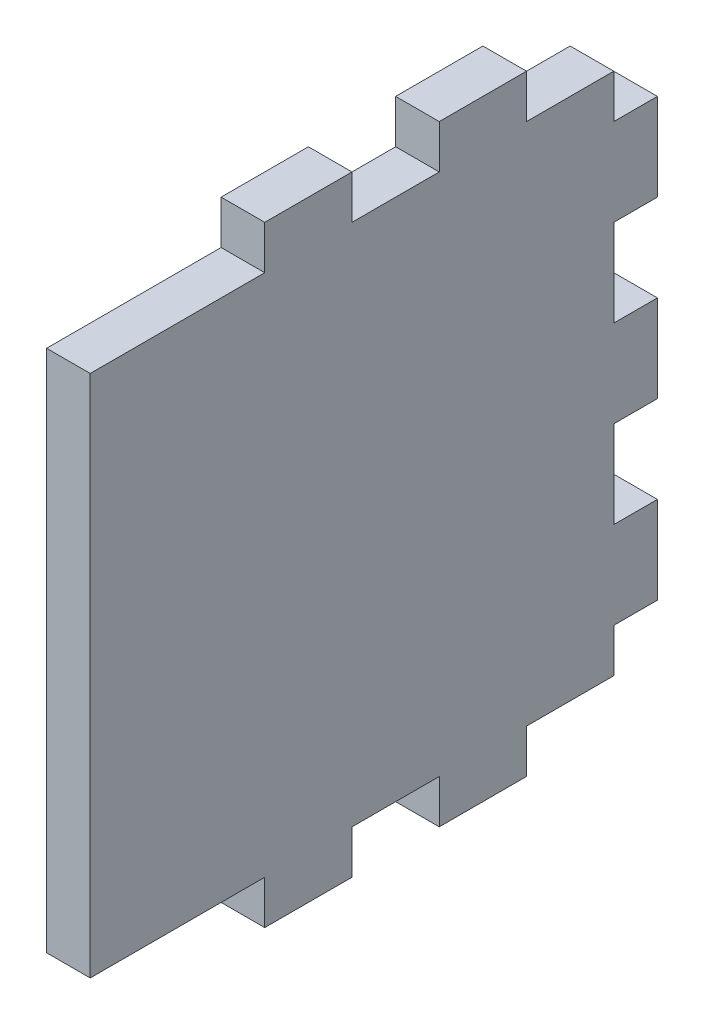
ISO-10303-21;
HEADER;
FILE_DESCRIPTION(('STEP AP214'),'2;1');
FILE_NAME('part.step','',(''),(''),'','','');
FILE_SCHEMA(('AUTOMOTIVE_DESIGN { 1 0 10303 214 1 1 1 1 }'));
ENDSEC;
DATA;
#1=APPLICATION_CONTEXT('core data for automotive mechanical design processes');
#2=APPLICATION_PROTOCOL_DEFINITION('international standard','automotive_design',2000,#1);
#3=PRODUCT_CONTEXT('',#1,'mechanical');
#4=PRODUCT('Part','Part','',(#3));
#5=PRODUCT_RELATED_PRODUCT_CATEGORY('part','',(#4));
#6=PRODUCT_DEFINITION_FORMATION('','',#4);
#7=PRODUCT_DEFINITION_CONTEXT('part definition',#1,'design');
#8=PRODUCT_DEFINITION('design','',#6,#7);
#9=PRODUCT_DEFINITION_SHAPE('','',#8);
#10=(LENGTH_UNIT() NAMED_UNIT(*) SI_UNIT(.MILLI.,.METRE.));
#11=(NAMED_UNIT(*) PLANE_ANGLE_UNIT() SI_UNIT($,.RADIAN.));
#12=(NAMED_UNIT(*) SI_UNIT($,.STERADIAN.) SOLID_ANGLE_UNIT());
#13=UNCERTAINTY_MEASURE_WITH_UNIT(LENGTH_MEASURE(1.E-05),#10,'distance_accuracy_value','');
#14=(GEOMETRIC_REPRESENTATION_CONTEXT(3) GLOBAL_UNCERTAINTY_ASSIGNED_CONTEXT((#13)) GLOBAL_UNIT_ASSIGNED_CONTEXT((#10,
#11,#12)) REPRESENTATION_CONTEXT('',''));
#15=CARTESIAN_POINT('',(0.,0.,0.));
#16=DIRECTION('',(0.,0.,1.));
#17=DIRECTION('',(1.,0.,0.));
#18=AXIS2_PLACEMENT_3D('',#15,#16,#17);
#19=CARTESIAN_POINT('',(6.35,0.,0.));
#20=DIRECTION('',(0.,1.,0.));
#21=DIRECTION('',(0.,0.,1.));
#22=AXIS2_PLACEMENT_3D('',#19,#20,#21);
#23=PLANE('',#22);
#24=DIRECTION('',(0.,0.,-1.));
#25=VECTOR('',#24,1.);
#26=CARTESIAN_POINT('',(0.,0.,0.));
#27=LINE('',#26,#25);
#28=CARTESIAN_POINT('',(0.,0.,57.15));
#29=VERTEX_POINT('',#28);
#30=CARTESIAN_POINT('',(0.,0.,44.45));
#31=VERTEX_POINT('',#30);
#32=EDGE_CURVE('E303',#29,#31,#27,.T.);
#33=ORIENTED_EDGE('',*,*,#32,.T.);
#34=DIRECTION('',(1.,0.,0.));
#35=VECTOR('',#34,1.);
#36=CARTESIAN_POINT('',(0.,0.,44.45));
#37=LINE('',#36,#35);
#38=CARTESIAN_POINT('',(6.35,0.,44.45));
#39=VERTEX_POINT('',#38);
#40=EDGE_CURVE('E516',#31,#39,#37,.T.);
#41=ORIENTED_EDGE('',*,*,#40,.T.);
#42=DIRECTION('',(0.,0.,-1.));
#43=VECTOR('',#42,1.);
#44=CARTESIAN_POINT('',(6.35,0.,0.));
#45=LINE('',#44,#43);
#46=CARTESIAN_POINT('',(6.35,0.,57.15));
#47=VERTEX_POINT('',#46);
#48=EDGE_CURVE('E432',#47,#39,#45,.T.);
#49=ORIENTED_EDGE('',*,*,#48,.F.);
#50=DIRECTION('',(1.,0.,0.));
#51=VECTOR('',#50,1.);
#52=CARTESIAN_POINT('',(0.,0.,57.15));
#53=LINE('',#52,#51);
#54=EDGE_CURVE('E357',#29,#47,#53,.T.);
#55=ORIENTED_EDGE('',*,*,#54,.F.);
#56=EDGE_LOOP('',(#33,#41,#49,#55));
#57=FACE_BOUND('',#56,.T.);
#58=ADVANCED_FACE('F45',(#57),#23,.F.);
#59=CARTESIAN_POINT('',(6.35,0.,0.));
#60=DIRECTION('',(0.,0.,1.));
#61=DIRECTION('',(1.,0.,0.));
#62=AXIS2_PLACEMENT_3D('',#59,#60,#61);
#63=PLANE('',#62);
#64=DIRECTION('',(0.,1.,0.));
#65=VECTOR('',#64,1.);
#66=CARTESIAN_POINT('',(0.,0.,0.));
#67=LINE('',#66,#65);
#68=CARTESIAN_POINT('',(0.,38.1,0.));
#69=VERTEX_POINT('',#68);
#70=CARTESIAN_POINT('',(0.,50.8,0.));
#71=VERTEX_POINT('',#70);
#72=EDGE_CURVE('E308',#69,#71,#67,.T.);
#73=ORIENTED_EDGE('',*,*,#72,.T.);
#74=DIRECTION('',(1.,0.,0.));
#75=VECTOR('',#74,1.);
#76=CARTESIAN_POINT('',(0.,50.8,0.));
#77=LINE('',#76,#75);
#78=CARTESIAN_POINT('',(6.35,50.8,0.));
#79=VERTEX_POINT('',#78);
#80=EDGE_CURVE('E329',#71,#79,#77,.T.);
#81=ORIENTED_EDGE('',*,*,#80,.T.);
#82=DIRECTION('',(0.,1.,0.));
#83=VECTOR('',#82,1.);
#84=CARTESIAN_POINT('',(6.35,0.,0.));
#85=LINE('',#84,#83);
#86=CARTESIAN_POINT('',(6.35,38.1,0.));
#87=VERTEX_POINT('',#86);
#88=EDGE_CURVE('E294',#87,#79,#85,.T.);
#89=ORIENTED_EDGE('',*,*,#88,.F.);
#90=DIRECTION('',(1.,0.,0.));
#91=VECTOR('',#90,1.);
#92=CARTESIAN_POINT('',(0.,38.1,0.));
#93=LINE('',#92,#91);
#94=EDGE_CURVE('E331',#69,#87,#93,.T.);
#95=ORIENTED_EDGE('',*,*,#94,.F.);
#96=EDGE_LOOP('',(#73,#81,#89,#95));
#97=FACE_BOUND('',#96,.T.);
#98=ADVANCED_FACE('F327',(#97),#63,.F.);
#99=CARTESIAN_POINT('',(6.35,12.7,0.));
#100=VERTEX_POINT('',#99);
#101=CARTESIAN_POINT('',(6.35,25.4,0.));
#102=VERTEX_POINT('',#101);
#103=EDGE_CURVE('E288',#100,#102,#85,.T.);
#104=ORIENTED_EDGE('',*,*,#103,.F.);
#105=DIRECTION('',(1.,0.,0.));
#106=VECTOR('',#105,1.);
#107=CARTESIAN_POINT('',(0.,12.7,0.));
#108=LINE('',#107,#106);
#109=CARTESIAN_POINT('',(0.,12.7,0.));
#110=VERTEX_POINT('',#109);
#111=EDGE_CURVE('E540',#110,#100,#108,.T.);
#112=ORIENTED_EDGE('',*,*,#111,.F.);
#113=CARTESIAN_POINT('',(0.,25.4,0.));
#114=VERTEX_POINT('',#113);
#115=EDGE_CURVE('E309',#110,#114,#67,.T.);
#116=ORIENTED_EDGE('',*,*,#115,.T.);
#117=DIRECTION('',(1.,0.,0.));
#118=VECTOR('',#117,1.);
#119=CARTESIAN_POINT('',(0.,25.4,0.));
#120=LINE('',#119,#118);
#121=EDGE_CURVE('E475',#114,#102,#120,.T.);
#122=ORIENTED_EDGE('',*,*,#121,.T.);
#123=EDGE_LOOP('',(#104,#112,#116,#122));
#124=FACE_BOUND('',#123,.T.);
#125=ADVANCED_FACE('F648',(#124),#63,.F.);
#126=CARTESIAN_POINT('',(6.35,88.9,0.));
#127=DIRECTION('',(0.,-1.,0.));
#128=DIRECTION('',(0.,0.,-1.));
#129=AXIS2_PLACEMENT_3D('',#126,#127,#128);
#130=PLANE('',#129);
#131=DIRECTION('',(0.,0.,1.));
#132=VECTOR('',#131,1.);
#133=CARTESIAN_POINT('',(6.35,88.9,0.));
#134=LINE('',#133,#132);
#135=CARTESIAN_POINT('',(6.35,88.9,44.45));
#136=VERTEX_POINT('',#135);
#137=CARTESIAN_POINT('',(6.35,88.9,57.15));
#138=VERTEX_POINT('',#137);
#139=EDGE_CURVE('E277',#136,#138,#134,.T.);
#140=ORIENTED_EDGE('',*,*,#139,.F.);
#141=DIRECTION('',(1.,0.,0.));
#142=VECTOR('',#141,1.);
#143=CARTESIAN_POINT('',(0.,88.9,44.45));
#144=LINE('',#143,#142);
#145=CARTESIAN_POINT('',(0.,88.9,44.45));
#146=VERTEX_POINT('',#145);
#147=EDGE_CURVE('E257',#146,#136,#144,.T.);
#148=ORIENTED_EDGE('',*,*,#147,.F.);
#149=DIRECTION('',(0.,0.,1.));
#150=VECTOR('',#149,1.);
#151=CARTESIAN_POINT('',(0.,88.9,0.));
#152=LINE('',#151,#150);
#153=CARTESIAN_POINT('',(0.,88.9,57.15));
#154=VERTEX_POINT('',#153);
#155=EDGE_CURVE('E310',#146,#154,#152,.T.);
#156=ORIENTED_EDGE('',*,*,#155,.T.);
#157=DIRECTION('',(1.,0.,0.));
#158=VECTOR('',#157,1.);
#159=CARTESIAN_POINT('',(0.,88.9,57.15));
#160=LINE('',#159,#158);
#161=EDGE_CURVE('E286',#154,#138,#160,.T.);
#162=ORIENTED_EDGE('',*,*,#161,.T.);
#163=EDGE_LOOP('',(#140,#148,#156,#162));
#164=FACE_BOUND('',#163,.T.);
#165=ADVANCED_FACE('F285',(#164),#130,.F.);
#166=CARTESIAN_POINT('',(0.,0.,31.75));
#167=VERTEX_POINT('',#166);
#168=CARTESIAN_POINT('',(0.,0.,19.05));
#169=VERTEX_POINT('',#168);
#170=EDGE_CURVE('E299',#167,#169,#27,.T.);
#171=ORIENTED_EDGE('',*,*,#170,.T.);
#172=DIRECTION('',(1.,0.,0.));
#173=VECTOR('',#172,1.);
#174=CARTESIAN_POINT('',(0.,0.,19.05));
#175=LINE('',#174,#173);
#176=CARTESIAN_POINT('',(6.35,0.,19.05));
#177=VERTEX_POINT('',#176);
#178=EDGE_CURVE('E282',#169,#177,#175,.T.);
#179=ORIENTED_EDGE('',*,*,#178,.T.);
#180=CARTESIAN_POINT('',(6.35,0.,31.75));
#181=VERTEX_POINT('',#180);
#182=EDGE_CURVE('E430',#181,#177,#45,.T.);
#183=ORIENTED_EDGE('',*,*,#182,.F.);
#184=DIRECTION('',(1.,0.,0.));
#185=VECTOR('',#184,1.);
#186=CARTESIAN_POINT('',(0.,0.,31.75));
#187=LINE('',#186,#185);
#188=EDGE_CURVE('E506',#167,#181,#187,.T.);
#189=ORIENTED_EDGE('',*,*,#188,.F.);
#190=EDGE_LOOP('',(#171,#179,#183,#189));
#191=FACE_BOUND('',#190,.T.);
#192=ADVANCED_FACE('F47',(#191),#23,.F.);
#193=CARTESIAN_POINT('',(6.35,63.5,0.));
#194=VERTEX_POINT('',#193);
#195=CARTESIAN_POINT('',(6.35,76.2,0.));
#196=VERTEX_POINT('',#195);
#197=EDGE_CURVE('E296',#194,#196,#85,.T.);
#198=ORIENTED_EDGE('',*,*,#197,.F.);
#199=DIRECTION('',(1.,0.,0.));
#200=VECTOR('',#199,1.);
#201=CARTESIAN_POINT('',(0.,63.5,0.));
#202=LINE('',#201,#200);
#203=CARTESIAN_POINT('',(0.,63.5,0.));
#204=VERTEX_POINT('',#203);
#205=EDGE_CURVE('E584',#204,#194,#202,.T.);
#206=ORIENTED_EDGE('',*,*,#205,.F.);
#207=CARTESIAN_POINT('',(0.,76.2,0.));
#208=VERTEX_POINT('',#207);
#209=EDGE_CURVE('E305',#204,#208,#67,.T.);
#210=ORIENTED_EDGE('',*,*,#209,.T.);
#211=DIRECTION('',(1.,0.,0.));
#212=VECTOR('',#211,1.);
#213=CARTESIAN_POINT('',(0.,76.2,0.));
#214=LINE('',#213,#212);
#215=EDGE_CURVE('E422',#208,#196,#214,.T.);
#216=ORIENTED_EDGE('',*,*,#215,.T.);
#217=EDGE_LOOP('',(#198,#206,#210,#216));
#218=FACE_BOUND('',#217,.T.);
#219=ADVANCED_FACE('F649',(#218),#63,.F.);
#220=CARTESIAN_POINT('',(0.,88.9,19.05));
#221=VERTEX_POINT('',#220);
#222=CARTESIAN_POINT('',(0.,88.9,31.75));
#223=VERTEX_POINT('',#222);
#224=EDGE_CURVE('E312',#221,#223,#152,.T.);
#225=ORIENTED_EDGE('',*,*,#224,.T.);
#226=DIRECTION('',(1.,0.,0.));
#227=VECTOR('',#226,1.);
#228=CARTESIAN_POINT('',(0.,88.9,31.75));
#229=LINE('',#228,#227);
#230=CARTESIAN_POINT('',(6.35,88.9,31.75));
#231=VERTEX_POINT('',#230);
#232=EDGE_CURVE('E269',#223,#231,#229,.T.);
#233=ORIENTED_EDGE('',*,*,#232,.T.);
#234=CARTESIAN_POINT('',(6.35,88.9,19.05));
#235=VERTEX_POINT('',#234);
#236=EDGE_CURVE('E55',#235,#231,#134,.T.);
#237=ORIENTED_EDGE('',*,*,#236,.F.);
#238=DIRECTION('',(1.,0.,0.));
#239=VECTOR('',#238,1.);
#240=CARTESIAN_POINT('',(0.,88.9,19.05));
#241=LINE('',#240,#239);
#242=EDGE_CURVE('E419',#221,#235,#241,.T.);
#243=ORIENTED_EDGE('',*,*,#242,.F.);
#244=EDGE_LOOP('',(#225,#233,#237,#243));
#245=FACE_BOUND('',#244,.T.);
#246=ADVANCED_FACE('F657',(#245),#130,.F.);
#247=CARTESIAN_POINT('',(6.35,0.,82.55));
#248=DIRECTION('',(0.,0.,-1.));
#249=DIRECTION('',(-1.,0.,0.));
#250=AXIS2_PLACEMENT_3D('',#247,#248,#249);
#251=PLANE('',#250);
#252=DIRECTION('',(0.,-1.,0.));
#253=VECTOR('',#252,1.);
#254=CARTESIAN_POINT('',(0.,0.,82.55));
#255=LINE('',#254,#253);
#256=CARTESIAN_POINT('',(0.,82.55,82.55));
#257=VERTEX_POINT('',#256);
#258=CARTESIAN_POINT('',(0.,6.35,82.55));
#259=VERTEX_POINT('',#258);
#260=EDGE_CURVE('E49',#257,#259,#255,.T.);
#261=ORIENTED_EDGE('',*,*,#260,.T.);
#262=DIRECTION('',(1.,0.,0.));
#263=VECTOR('',#262,1.);
#264=CARTESIAN_POINT('',(0.,6.35,82.55));
#265=LINE('',#264,#263);
#266=CARTESIAN_POINT('',(6.35,6.35,82.55));
#267=VERTEX_POINT('',#266);
#268=EDGE_CURVE('E364',#259,#267,#265,.T.);
#269=ORIENTED_EDGE('',*,*,#268,.T.);
#270=DIRECTION('',(0.,-1.,0.));
#271=VECTOR('',#270,1.);
#272=CARTESIAN_POINT('',(6.35,0.,82.55));
#273=LINE('',#272,#271);
#274=CARTESIAN_POINT('',(6.35,82.55,82.55));
#275=VERTEX_POINT('',#274);
#276=EDGE_CURVE('E11',#275,#267,#273,.T.);
#277=ORIENTED_EDGE('',*,*,#276,.F.);
#278=DIRECTION('',(1.,0.,0.));
#279=VECTOR('',#278,1.);
#280=CARTESIAN_POINT('',(0.,82.55,82.55));
#281=LINE('',#280,#279);
#282=EDGE_CURVE('E445',#257,#275,#281,.T.);
#283=ORIENTED_EDGE('',*,*,#282,.F.);
#284=EDGE_LOOP('',(#261,#269,#277,#283));
#285=FACE_BOUND('',#284,.T.);
#286=ADVANCED_FACE('F443',(#285),#251,.F.);
#287=CARTESIAN_POINT('',(6.35,0.,0.));
#288=DIRECTION('',(-1.,0.,0.));
#289=DIRECTION('',(0.,0.,1.));
#290=AXIS2_PLACEMENT_3D('',#287,#288,#289);
#291=PLANE('',#290);
#292=ORIENTED_EDGE('',*,*,#182,.T.);
#293=DIRECTION('',(0.,-1.,0.));
#294=VECTOR('',#293,1.);
#295=CARTESIAN_POINT('',(6.35,6.35,19.05));
#296=LINE('',#295,#294);
#297=CARTESIAN_POINT('',(6.35,6.35,19.05));
#298=VERTEX_POINT('',#297);
#299=EDGE_CURVE('E556',#298,#177,#296,.T.);
#300=ORIENTED_EDGE('',*,*,#299,.F.);
#301=DIRECTION('',(0.,0.,1.));
#302=VECTOR('',#301,1.);
#303=CARTESIAN_POINT('',(6.35,6.35,6.35));
#304=LINE('',#303,#302);
#305=CARTESIAN_POINT('',(6.35,6.35,6.35));
#306=VERTEX_POINT('',#305);
#307=EDGE_CURVE('E559',#306,#298,#304,.T.);
#308=ORIENTED_EDGE('',*,*,#307,.F.);
#309=DIRECTION('',(0.,-1.,0.));
#310=VECTOR('',#309,1.);
#311=CARTESIAN_POINT('',(6.35,6.35,6.35));
#312=LINE('',#311,#310);
#313=CARTESIAN_POINT('',(6.35,12.7,6.35));
#314=VERTEX_POINT('',#313);
#315=EDGE_CURVE('E564',#314,#306,#312,.T.);
#316=ORIENTED_EDGE('',*,*,#315,.F.);
#317=DIRECTION('',(0.,0.,1.));
#318=VECTOR('',#317,1.);
#319=CARTESIAN_POINT('',(6.35,12.7,0.));
#320=LINE('',#319,#318);
#321=EDGE_CURVE('E520',#100,#314,#320,.T.);
#322=ORIENTED_EDGE('',*,*,#321,.F.);
#323=ORIENTED_EDGE('',*,*,#103,.T.);
#324=DIRECTION('',(0.,0.,-1.));
#325=VECTOR('',#324,1.);
#326=CARTESIAN_POINT('',(6.35,25.4,0.));
#327=LINE('',#326,#325);
#328=CARTESIAN_POINT('',(6.35,25.4,6.35));
#329=VERTEX_POINT('',#328);
#330=EDGE_CURVE('E496',#329,#102,#327,.T.);
#331=ORIENTED_EDGE('',*,*,#330,.F.);
#332=DIRECTION('',(0.,-1.,0.));
#333=VECTOR('',#332,1.);
#334=CARTESIAN_POINT('',(6.35,25.4,6.35));
#335=LINE('',#334,#333);
#336=CARTESIAN_POINT('',(6.35,38.1,6.35));
#337=VERTEX_POINT('',#336);
#338=EDGE_CURVE('E487',#337,#329,#335,.T.);
#339=ORIENTED_EDGE('',*,*,#338,.F.);
#340=DIRECTION('',(0.,0.,1.));
#341=VECTOR('',#340,1.);
#342=CARTESIAN_POINT('',(6.35,38.1,0.));
#343=LINE('',#342,#341);
#344=EDGE_CURVE('E491',#87,#337,#343,.T.);
#345=ORIENTED_EDGE('',*,*,#344,.F.);
#346=ORIENTED_EDGE('',*,*,#88,.T.);
#347=DIRECTION('',(0.,0.,-1.));
#348=VECTOR('',#347,1.);
#349=CARTESIAN_POINT('',(6.35,50.8,0.));
#350=LINE('',#349,#348);
#351=CARTESIAN_POINT('',(6.35,50.8,6.35));
#352=VERTEX_POINT('',#351);
#353=EDGE_CURVE('E407',#352,#79,#350,.T.);
#354=ORIENTED_EDGE('',*,*,#353,.F.);
#355=DIRECTION('',(0.,-1.,0.));
#356=VECTOR('',#355,1.);
#357=CARTESIAN_POINT('',(6.35,50.8,6.35));
#358=LINE('',#357,#356);
#359=CARTESIAN_POINT('',(6.35,63.5,6.35));
#360=VERTEX_POINT('',#359);
#361=EDGE_CURVE('E346',#360,#352,#358,.T.);
#362=ORIENTED_EDGE('',*,*,#361,.F.);
#363=DIRECTION('',(0.,0.,1.));
#364=VECTOR('',#363,1.);
#365=CARTESIAN_POINT('',(6.35,63.5,0.));
#366=LINE('',#365,#364);
#367=EDGE_CURVE('E352',#194,#360,#366,.T.);
#368=ORIENTED_EDGE('',*,*,#367,.F.);
#369=ORIENTED_EDGE('',*,*,#197,.T.);
#370=DIRECTION('',(0.,0.,-1.));
#371=VECTOR('',#370,1.);
#372=CARTESIAN_POINT('',(6.35,76.2,0.));
#373=LINE('',#372,#371);
#374=CARTESIAN_POINT('',(6.35,76.2,6.35000000000001));
#375=VERTEX_POINT('',#374);
#376=EDGE_CURVE('E411',#375,#196,#373,.T.);
#377=ORIENTED_EDGE('',*,*,#376,.F.);
#378=DIRECTION('',(0.,-1.,0.));
#379=VECTOR('',#378,1.);
#380=CARTESIAN_POINT('',(6.35,76.2,6.35000000000001));
#381=LINE('',#380,#379);
#382=CARTESIAN_POINT('',(6.35,82.55,6.35000000000001));
#383=VERTEX_POINT('',#382);
#384=EDGE_CURVE('E406',#383,#375,#381,.T.);
#385=ORIENTED_EDGE('',*,*,#384,.F.);
#386=DIRECTION('',(0.,0.,-1.));
#387=VECTOR('',#386,1.);
#388=CARTESIAN_POINT('',(6.35,82.55,6.35000000000001));
#389=LINE('',#388,#387);
#390=CARTESIAN_POINT('',(6.35,82.55,19.05));
#391=VERTEX_POINT('',#390);
#392=EDGE_CURVE('E402',#391,#383,#389,.T.);
#393=ORIENTED_EDGE('',*,*,#392,.F.);
#394=DIRECTION('',(0.,-1.,0.));
#395=VECTOR('',#394,1.);
#396=CARTESIAN_POINT('',(6.35,88.9,19.05));
#397=LINE('',#396,#395);
#398=EDGE_CURVE('E389',#235,#391,#397,.T.);
#399=ORIENTED_EDGE('',*,*,#398,.F.);
#400=ORIENTED_EDGE('',*,*,#236,.T.);
#401=DIRECTION('',(0.,1.,0.));
#402=VECTOR('',#401,1.);
#403=CARTESIAN_POINT('',(6.35,88.9,31.75));
#404=LINE('',#403,#402);
#405=CARTESIAN_POINT('',(6.35,82.55,31.75));
#406=VERTEX_POINT('',#405);
#407=EDGE_CURVE('E599',#406,#231,#404,.T.);
#408=ORIENTED_EDGE('',*,*,#407,.F.);
#409=DIRECTION('',(0.,0.,-1.));
#410=VECTOR('',#409,1.);
#411=CARTESIAN_POINT('',(6.35,82.55,44.45));
#412=LINE('',#411,#410);
#413=CARTESIAN_POINT('',(6.35,82.55,44.45));
#414=VERTEX_POINT('',#413);
#415=EDGE_CURVE('E280',#414,#406,#412,.T.);
#416=ORIENTED_EDGE('',*,*,#415,.F.);
#417=DIRECTION('',(0.,-1.,0.));
#418=VECTOR('',#417,1.);
#419=CARTESIAN_POINT('',(6.35,88.9,44.45));
#420=LINE('',#419,#418);
#421=EDGE_CURVE('E260',#136,#414,#420,.T.);
#422=ORIENTED_EDGE('',*,*,#421,.F.);
#423=ORIENTED_EDGE('',*,*,#139,.T.);
#424=DIRECTION('',(0.,1.,0.));
#425=VECTOR('',#424,1.);
#426=CARTESIAN_POINT('',(6.35,88.9,57.15));
#427=LINE('',#426,#425);
#428=CARTESIAN_POINT('',(6.35,82.55,57.15));
#429=VERTEX_POINT('',#428);
#430=EDGE_CURVE('E461',#429,#138,#427,.T.);
#431=ORIENTED_EDGE('',*,*,#430,.F.);
#432=DIRECTION('',(0.,0.,-1.));
#433=VECTOR('',#432,1.);
#434=CARTESIAN_POINT('',(6.35,82.55,82.55));
#435=LINE('',#434,#433);
#436=EDGE_CURVE('E270',#275,#429,#435,.T.);
#437=ORIENTED_EDGE('',*,*,#436,.F.);
#438=ORIENTED_EDGE('',*,*,#276,.T.);
#439=DIRECTION('',(0.,0.,1.));
#440=VECTOR('',#439,1.);
#441=CARTESIAN_POINT('',(6.35,6.35,82.55));
#442=LINE('',#441,#440);
#443=CARTESIAN_POINT('',(6.35,6.35,57.15));
#444=VERTEX_POINT('',#443);
#445=EDGE_CURVE('E369',#444,#267,#442,.T.);
#446=ORIENTED_EDGE('',*,*,#445,.F.);
#447=DIRECTION('',(0.,1.,0.));
#448=VECTOR('',#447,1.);
#449=CARTESIAN_POINT('',(6.35,0.,57.15));
#450=LINE('',#449,#448);
#451=EDGE_CURVE('E372',#47,#444,#450,.T.);
#452=ORIENTED_EDGE('',*,*,#451,.F.);
#453=ORIENTED_EDGE('',*,*,#48,.T.);
#454=DIRECTION('',(0.,-1.,0.));
#455=VECTOR('',#454,1.);
#456=CARTESIAN_POINT('',(6.35,0.,44.45));
#457=LINE('',#456,#455);
#458=CARTESIAN_POINT('',(6.35,6.35,44.45));
#459=VERTEX_POINT('',#458);
#460=EDGE_CURVE('E521',#459,#39,#457,.T.);
#461=ORIENTED_EDGE('',*,*,#460,.F.);
#462=DIRECTION('',(0.,0.,1.));
#463=VECTOR('',#462,1.);
#464=CARTESIAN_POINT('',(6.35,6.35,44.45));
#465=LINE('',#464,#463);
#466=CARTESIAN_POINT('',(6.35,6.35,31.75));
#467=VERTEX_POINT('',#466);
#468=EDGE_CURVE('E524',#467,#459,#465,.T.);
#469=ORIENTED_EDGE('',*,*,#468,.F.);
#470=DIRECTION('',(0.,1.,0.));
#471=VECTOR('',#470,1.);
#472=CARTESIAN_POINT('',(6.35,0.,31.75));
#473=LINE('',#472,#471);
#474=EDGE_CURVE('E368',#181,#467,#473,.T.);
#475=ORIENTED_EDGE('',*,*,#474,.F.);
#476=EDGE_LOOP('',(#292,#300,#308,#316,#322,#323,#331,#339,#345,#346,#354,#362,#368,#369,#377,
#385,#393,#399,#400,#408,#416,#422,#423,#431,#437,#438,#446,#452,#453,#461,#469,#475));
#477=FACE_BOUND('',#476,.T.);
#478=ADVANCED_FACE('F275',(#477),#291,.F.);
#479=CARTESIAN_POINT('',(0.,0.,0.));
#480=DIRECTION('',(-1.,0.,0.));
#481=DIRECTION('',(0.,0.,1.));
#482=AXIS2_PLACEMENT_3D('',#479,#480,#481);
#483=PLANE('',#482);
#484=DIRECTION('',(0.,-1.,0.));
#485=VECTOR('',#484,1.);
#486=CARTESIAN_POINT('',(0.,6.35,19.05));
#487=LINE('',#486,#485);
#488=CARTESIAN_POINT('',(0.,6.35,19.05));
#489=VERTEX_POINT('',#488);
#490=EDGE_CURVE('E543',#489,#169,#487,.T.);
#491=ORIENTED_EDGE('',*,*,#490,.T.);
#492=ORIENTED_EDGE('',*,*,#170,.F.);
#493=DIRECTION('',(0.,1.,0.));
#494=VECTOR('',#493,1.);
#495=CARTESIAN_POINT('',(0.,0.,31.75));
#496=LINE('',#495,#494);
#497=CARTESIAN_POINT('',(0.,6.35,31.75));
#498=VERTEX_POINT('',#497);
#499=EDGE_CURVE('E525',#167,#498,#496,.T.);
#500=ORIENTED_EDGE('',*,*,#499,.T.);
#501=DIRECTION('',(0.,0.,1.));
#502=VECTOR('',#501,1.);
#503=CARTESIAN_POINT('',(0.,6.35,44.45));
#504=LINE('',#503,#502);
#505=CARTESIAN_POINT('',(0.,6.35,44.45));
#506=VERTEX_POINT('',#505);
#507=EDGE_CURVE('E71',#498,#506,#504,.T.);
#508=ORIENTED_EDGE('',*,*,#507,.T.);
#509=DIRECTION('',(0.,-1.,0.));
#510=VECTOR('',#509,1.);
#511=CARTESIAN_POINT('',(0.,0.,44.45));
#512=LINE('',#511,#510);
#513=EDGE_CURVE('E509',#506,#31,#512,.T.);
#514=ORIENTED_EDGE('',*,*,#513,.T.);
#515=ORIENTED_EDGE('',*,*,#32,.F.);
#516=DIRECTION('',(0.,1.,0.));
#517=VECTOR('',#516,1.);
#518=CARTESIAN_POINT('',(0.,0.,57.15));
#519=LINE('',#518,#517);
#520=CARTESIAN_POINT('',(0.,6.35,57.15));
#521=VERTEX_POINT('',#520);
#522=EDGE_CURVE('E373',#29,#521,#519,.T.);
#523=ORIENTED_EDGE('',*,*,#522,.T.);
#524=DIRECTION('',(0.,0.,1.));
#525=VECTOR('',#524,1.);
#526=CARTESIAN_POINT('',(0.,6.35,82.55));
#527=LINE('',#526,#525);
#528=EDGE_CURVE('E360',#521,#259,#527,.T.);
#529=ORIENTED_EDGE('',*,*,#528,.T.);
#530=ORIENTED_EDGE('',*,*,#260,.F.);
#531=DIRECTION('',(0.,0.,-1.));
#532=VECTOR('',#531,1.);
#533=CARTESIAN_POINT('',(0.,82.55,82.55));
#534=LINE('',#533,#532);
#535=CARTESIAN_POINT('',(0.,82.55,57.15));
#536=VERTEX_POINT('',#535);
#537=EDGE_CURVE('E448',#257,#536,#534,.T.);
#538=ORIENTED_EDGE('',*,*,#537,.T.);
#539=DIRECTION('',(0.,1.,0.));
#540=VECTOR('',#539,1.);
#541=CARTESIAN_POINT('',(0.,88.9,57.15));
#542=LINE('',#541,#540);
#543=EDGE_CURVE('E470',#536,#154,#542,.T.);
#544=ORIENTED_EDGE('',*,*,#543,.T.);
#545=ORIENTED_EDGE('',*,*,#155,.F.);
#546=DIRECTION('',(0.,-1.,0.));
#547=VECTOR('',#546,1.);
#548=CARTESIAN_POINT('',(0.,88.9,44.45));
#549=LINE('',#548,#547);
#550=CARTESIAN_POINT('',(0.,82.55,44.45));
#551=VERTEX_POINT('',#550);
#552=EDGE_CURVE('E263',#146,#551,#549,.T.);
#553=ORIENTED_EDGE('',*,*,#552,.T.);
#554=DIRECTION('',(0.,0.,-1.));
#555=VECTOR('',#554,1.);
#556=CARTESIAN_POINT('',(0.,82.55,44.45));
#557=LINE('',#556,#555);
#558=CARTESIAN_POINT('',(0.,82.55,31.75));
#559=VERTEX_POINT('',#558);
#560=EDGE_CURVE('E604',#551,#559,#557,.T.);
#561=ORIENTED_EDGE('',*,*,#560,.T.);
#562=DIRECTION('',(0.,1.,0.));
#563=VECTOR('',#562,1.);
#564=CARTESIAN_POINT('',(0.,88.9,31.75));
#565=LINE('',#564,#563);
#566=EDGE_CURVE('E608',#559,#223,#565,.T.);
#567=ORIENTED_EDGE('',*,*,#566,.T.);
#568=ORIENTED_EDGE('',*,*,#224,.F.);
#569=DIRECTION('',(0.,-1.,0.));
#570=VECTOR('',#569,1.);
#571=CARTESIAN_POINT('',(0.,88.9,19.05));
#572=LINE('',#571,#570);
#573=CARTESIAN_POINT('',(0.,82.55,19.05));
#574=VERTEX_POINT('',#573);
#575=EDGE_CURVE('E397',#221,#574,#572,.T.);
#576=ORIENTED_EDGE('',*,*,#575,.T.);
#577=DIRECTION('',(0.,0.,-1.));
#578=VECTOR('',#577,1.);
#579=CARTESIAN_POINT('',(0.,82.55,6.35000000000001));
#580=LINE('',#579,#578);
#581=CARTESIAN_POINT('',(0.,82.55,6.35000000000001));
#582=VERTEX_POINT('',#581);
#583=EDGE_CURVE('E384',#574,#582,#580,.T.);
#584=ORIENTED_EDGE('',*,*,#583,.T.);
#585=DIRECTION('',(0.,-1.,0.));
#586=VECTOR('',#585,1.);
#587=CARTESIAN_POINT('',(0.,76.2,6.35000000000001));
#588=LINE('',#587,#586);
#589=CARTESIAN_POINT('',(0.,76.2,6.35000000000001));
#590=VERTEX_POINT('',#589);
#591=EDGE_CURVE('E388',#582,#590,#588,.T.);
#592=ORIENTED_EDGE('',*,*,#591,.T.);
#593=DIRECTION('',(0.,0.,-1.));
#594=VECTOR('',#593,1.);
#595=CARTESIAN_POINT('',(0.,76.2,0.));
#596=LINE('',#595,#594);
#597=EDGE_CURVE('E393',#590,#208,#596,.T.);
#598=ORIENTED_EDGE('',*,*,#597,.T.);
#599=ORIENTED_EDGE('',*,*,#209,.F.);
#600=DIRECTION('',(0.,0.,1.));
#601=VECTOR('',#600,1.);
#602=CARTESIAN_POINT('',(0.,63.5,0.));
#603=LINE('',#602,#601);
#604=CARTESIAN_POINT('',(0.,63.5,6.35));
#605=VERTEX_POINT('',#604);
#606=EDGE_CURVE('E347',#204,#605,#603,.T.);
#607=ORIENTED_EDGE('',*,*,#606,.T.);
#608=DIRECTION('',(0.,-1.,0.));
#609=VECTOR('',#608,1.);
#610=CARTESIAN_POINT('',(0.,50.8,6.35));
#611=LINE('',#610,#609);
#612=CARTESIAN_POINT('',(0.,50.8,6.35));
#613=VERTEX_POINT('',#612);
#614=EDGE_CURVE('E343',#605,#613,#611,.T.);
#615=ORIENTED_EDGE('',*,*,#614,.T.);
#616=DIRECTION('',(0.,0.,-1.));
#617=VECTOR('',#616,1.);
#618=CARTESIAN_POINT('',(0.,50.8,0.));
#619=LINE('',#618,#617);
#620=EDGE_CURVE('E341',#613,#71,#619,.T.);
#621=ORIENTED_EDGE('',*,*,#620,.T.);
#622=ORIENTED_EDGE('',*,*,#72,.F.);
#623=DIRECTION('',(0.,0.,1.));
#624=VECTOR('',#623,1.);
#625=CARTESIAN_POINT('',(0.,38.1,0.));
#626=LINE('',#625,#624);
#627=CARTESIAN_POINT('',(0.,38.1,6.35));
#628=VERTEX_POINT('',#627);
#629=EDGE_CURVE('E338',#69,#628,#626,.T.);
#630=ORIENTED_EDGE('',*,*,#629,.T.);
#631=DIRECTION('',(0.,-1.,0.));
#632=VECTOR('',#631,1.);
#633=CARTESIAN_POINT('',(0.,25.4,6.35));
#634=LINE('',#633,#632);
#635=CARTESIAN_POINT('',(0.,25.4,6.35));
#636=VERTEX_POINT('',#635);
#637=EDGE_CURVE('E478',#628,#636,#634,.T.);
#638=ORIENTED_EDGE('',*,*,#637,.T.);
#639=DIRECTION('',(0.,0.,-1.));
#640=VECTOR('',#639,1.);
#641=CARTESIAN_POINT('',(0.,25.4,0.));
#642=LINE('',#641,#640);
#643=EDGE_CURVE('E492',#636,#114,#642,.T.);
#644=ORIENTED_EDGE('',*,*,#643,.T.);
#645=ORIENTED_EDGE('',*,*,#115,.F.);
#646=DIRECTION('',(0.,0.,1.));
#647=VECTOR('',#646,1.);
#648=CARTESIAN_POINT('',(0.,12.7,0.));
#649=LINE('',#648,#647);
#650=CARTESIAN_POINT('',(0.,12.7,6.35));
#651=VERTEX_POINT('',#650);
#652=EDGE_CURVE('E560',#110,#651,#649,.T.);
#653=ORIENTED_EDGE('',*,*,#652,.T.);
#654=DIRECTION('',(0.,-1.,0.));
#655=VECTOR('',#654,1.);
#656=CARTESIAN_POINT('',(0.,6.35,6.35));
#657=LINE('',#656,#655);
#658=CARTESIAN_POINT('',(0.,6.35,6.35));
#659=VERTEX_POINT('',#658);
#660=EDGE_CURVE('E63',#651,#659,#657,.T.);
#661=ORIENTED_EDGE('',*,*,#660,.T.);
#662=DIRECTION('',(0.,0.,1.));
#663=VECTOR('',#662,1.);
#664=CARTESIAN_POINT('',(0.,6.35,6.35));
#665=LINE('',#664,#663);
#666=EDGE_CURVE('E573',#659,#489,#665,.T.);
#667=ORIENTED_EDGE('',*,*,#666,.T.);
#668=EDGE_LOOP('',(#491,#492,#500,#508,#514,#515,#523,#529,#530,#538,#544,#545,#553,#561,#567,
#568,#576,#584,#592,#598,#599,#607,#615,#621,#622,#630,#638,#644,#645,#653,#661,#667));
#669=FACE_BOUND('',#668,.T.);
#670=ADVANCED_FACE('F336',(#669),#483,.T.);
#671=CARTESIAN_POINT('',(0.,82.55,6.35000000000001));
#672=DIRECTION('',(0.,-1.,0.));
#673=DIRECTION('',(0.,0.,-1.));
#674=AXIS2_PLACEMENT_3D('',#671,#672,#673);
#675=PLANE('',#674);
#676=ORIENTED_EDGE('',*,*,#392,.T.);
#677=DIRECTION('',(1.,0.,0.));
#678=VECTOR('',#677,1.);
#679=CARTESIAN_POINT('',(0.,82.55,6.35000000000001));
#680=LINE('',#679,#678);
#681=EDGE_CURVE('E401',#582,#383,#680,.T.);
#682=ORIENTED_EDGE('',*,*,#681,.F.);
#683=ORIENTED_EDGE('',*,*,#583,.F.);
#684=DIRECTION('',(1.,0.,0.));
#685=VECTOR('',#684,1.);
#686=CARTESIAN_POINT('',(0.,82.55,19.05));
#687=LINE('',#686,#685);
#688=EDGE_CURVE('E304',#574,#391,#687,.T.);
#689=ORIENTED_EDGE('',*,*,#688,.T.);
#690=EDGE_LOOP('',(#676,#682,#683,#689));
#691=FACE_BOUND('',#690,.T.);
#692=ADVANCED_FACE('F706',(#691),#675,.F.);
#693=CARTESIAN_POINT('',(0.,88.9,19.05));
#694=DIRECTION('',(0.,0.,1.));
#695=DIRECTION('',(1.,0.,0.));
#696=AXIS2_PLACEMENT_3D('',#693,#694,#695);
#697=PLANE('',#696);
#698=ORIENTED_EDGE('',*,*,#398,.T.);
#699=ORIENTED_EDGE('',*,*,#688,.F.);
#700=ORIENTED_EDGE('',*,*,#575,.F.);
#701=ORIENTED_EDGE('',*,*,#242,.T.);
#702=EDGE_LOOP('',(#698,#699,#700,#701));
#703=FACE_BOUND('',#702,.T.);
#704=ADVANCED_FACE('F708',(#703),#697,.F.);
#705=CARTESIAN_POINT('',(0.,76.2,0.));
#706=DIRECTION('',(0.,-1.,0.));
#707=DIRECTION('',(0.,0.,-1.));
#708=AXIS2_PLACEMENT_3D('',#705,#706,#707);
#709=PLANE('',#708);
#710=ORIENTED_EDGE('',*,*,#376,.T.);
#711=ORIENTED_EDGE('',*,*,#215,.F.);
#712=ORIENTED_EDGE('',*,*,#597,.F.);
#713=DIRECTION('',(1.,0.,0.));
#714=VECTOR('',#713,1.);
#715=CARTESIAN_POINT('',(0.,76.2,6.35000000000001));
#716=LINE('',#715,#714);
#717=EDGE_CURVE('E426',#590,#375,#716,.T.);
#718=ORIENTED_EDGE('',*,*,#717,.T.);
#719=EDGE_LOOP('',(#710,#711,#712,#718));
#720=FACE_BOUND('',#719,.T.);
#721=ADVANCED_FACE('F697',(#720),#709,.F.);
#722=CARTESIAN_POINT('',(0.,76.2,6.35000000000001));
#723=DIRECTION('',(0.,0.,1.));
#724=DIRECTION('',(1.,0.,0.));
#725=AXIS2_PLACEMENT_3D('',#722,#723,#724);
#726=PLANE('',#725);
#727=ORIENTED_EDGE('',*,*,#384,.T.);
#728=ORIENTED_EDGE('',*,*,#717,.F.);
#729=ORIENTED_EDGE('',*,*,#591,.F.);
#730=ORIENTED_EDGE('',*,*,#681,.T.);
#731=EDGE_LOOP('',(#727,#728,#729,#730));
#732=FACE_BOUND('',#731,.T.);
#733=ADVANCED_FACE('F702',(#732),#726,.F.);
#734=CARTESIAN_POINT('',(0.,25.4,0.));
#735=DIRECTION('',(0.,-1.,0.));
#736=DIRECTION('',(0.,0.,-1.));
#737=AXIS2_PLACEMENT_3D('',#734,#735,#736);
#738=PLANE('',#737);
#739=ORIENTED_EDGE('',*,*,#330,.T.);
#740=ORIENTED_EDGE('',*,*,#121,.F.);
#741=ORIENTED_EDGE('',*,*,#643,.F.);
#742=DIRECTION('',(1.,0.,0.));
#743=VECTOR('',#742,1.);
#744=CARTESIAN_POINT('',(0.,25.4,6.35));
#745=LINE('',#744,#743);
#746=EDGE_CURVE('E484',#636,#329,#745,.T.);
#747=ORIENTED_EDGE('',*,*,#746,.T.);
#748=EDGE_LOOP('',(#739,#740,#741,#747));
#749=FACE_BOUND('',#748,.T.);
#750=ADVANCED_FACE('F678',(#749),#738,.F.);
#751=CARTESIAN_POINT('',(0.,25.4,6.35));
#752=DIRECTION('',(0.,0.,1.));
#753=DIRECTION('',(1.,0.,0.));
#754=AXIS2_PLACEMENT_3D('',#751,#752,#753);
#755=PLANE('',#754);
#756=ORIENTED_EDGE('',*,*,#338,.T.);
#757=ORIENTED_EDGE('',*,*,#746,.F.);
#758=ORIENTED_EDGE('',*,*,#637,.F.);
#759=DIRECTION('',(1.,0.,0.));
#760=VECTOR('',#759,1.);
#761=CARTESIAN_POINT('',(0.,38.1,6.35));
#762=LINE('',#761,#760);
#763=EDGE_CURVE('E481',#628,#337,#762,.T.);
#764=ORIENTED_EDGE('',*,*,#763,.T.);
#765=EDGE_LOOP('',(#756,#757,#758,#764));
#766=FACE_BOUND('',#765,.T.);
#767=ADVANCED_FACE('F681',(#766),#755,.F.);
#768=CARTESIAN_POINT('',(0.,38.1,0.));
#769=DIRECTION('',(0.,1.,0.));
#770=DIRECTION('',(0.,0.,1.));
#771=AXIS2_PLACEMENT_3D('',#768,#769,#770);
#772=PLANE('',#771);
#773=ORIENTED_EDGE('',*,*,#344,.T.);
#774=ORIENTED_EDGE('',*,*,#763,.F.);
#775=ORIENTED_EDGE('',*,*,#629,.F.);
#776=ORIENTED_EDGE('',*,*,#94,.T.);
#777=EDGE_LOOP('',(#773,#774,#775,#776));
#778=FACE_BOUND('',#777,.T.);
#779=ADVANCED_FACE('F640',(#778),#772,.F.);
#780=CARTESIAN_POINT('',(0.,88.9,57.15));
#781=DIRECTION('',(0.,0.,-1.));
#782=DIRECTION('',(-1.,0.,0.));
#783=AXIS2_PLACEMENT_3D('',#780,#781,#782);
#784=PLANE('',#783);
#785=ORIENTED_EDGE('',*,*,#430,.T.);
#786=ORIENTED_EDGE('',*,*,#161,.F.);
#787=ORIENTED_EDGE('',*,*,#543,.F.);
#788=DIRECTION('',(1.,0.,0.));
#789=VECTOR('',#788,1.);
#790=CARTESIAN_POINT('',(0.,82.55,57.15));
#791=LINE('',#790,#789);
#792=EDGE_CURVE('E626',#536,#429,#791,.T.);
#793=ORIENTED_EDGE('',*,*,#792,.T.);
#794=EDGE_LOOP('',(#785,#786,#787,#793));
#795=FACE_BOUND('',#794,.T.);
#796=ADVANCED_FACE('F630',(#795),#784,.F.);
#797=CARTESIAN_POINT('',(0.,82.55,82.55));
#798=DIRECTION('',(0.,-1.,0.));
#799=DIRECTION('',(0.,0.,-1.));
#800=AXIS2_PLACEMENT_3D('',#797,#798,#799);
#801=PLANE('',#800);
#802=ORIENTED_EDGE('',*,*,#436,.T.);
#803=ORIENTED_EDGE('',*,*,#792,.F.);
#804=ORIENTED_EDGE('',*,*,#537,.F.);
#805=ORIENTED_EDGE('',*,*,#282,.T.);
#806=EDGE_LOOP('',(#802,#803,#804,#805));
#807=FACE_BOUND('',#806,.T.);
#808=ADVANCED_FACE('F631',(#807),#801,.F.);
#809=CARTESIAN_POINT('',(0.,88.9,44.45));
#810=DIRECTION('',(0.,0.,1.));
#811=DIRECTION('',(1.,0.,0.));
#812=AXIS2_PLACEMENT_3D('',#809,#810,#811);
#813=PLANE('',#812);
#814=ORIENTED_EDGE('',*,*,#421,.T.);
#815=DIRECTION('',(1.,0.,0.));
#816=VECTOR('',#815,1.);
#817=CARTESIAN_POINT('',(0.,82.55,44.45));
#818=LINE('',#817,#816);
#819=EDGE_CURVE('E612',#551,#414,#818,.T.);
#820=ORIENTED_EDGE('',*,*,#819,.F.);
#821=ORIENTED_EDGE('',*,*,#552,.F.);
#822=ORIENTED_EDGE('',*,*,#147,.T.);
#823=EDGE_LOOP('',(#814,#820,#821,#822));
#824=FACE_BOUND('',#823,.T.);
#825=ADVANCED_FACE('F259',(#824),#813,.F.);
#826=CARTESIAN_POINT('',(0.,88.9,31.75));
#827=DIRECTION('',(0.,0.,-1.));
#828=DIRECTION('',(-1.,0.,0.));
#829=AXIS2_PLACEMENT_3D('',#826,#827,#828);
#830=PLANE('',#829);
#831=ORIENTED_EDGE('',*,*,#407,.T.);
#832=ORIENTED_EDGE('',*,*,#232,.F.);
#833=ORIENTED_EDGE('',*,*,#566,.F.);
#834=DIRECTION('',(1.,0.,0.));
#835=VECTOR('',#834,1.);
#836=CARTESIAN_POINT('',(0.,82.55,31.75));
#837=LINE('',#836,#835);
#838=EDGE_CURVE('E615',#559,#406,#837,.T.);
#839=ORIENTED_EDGE('',*,*,#838,.T.);
#840=EDGE_LOOP('',(#831,#832,#833,#839));
#841=FACE_BOUND('',#840,.T.);
#842=ADVANCED_FACE('F638',(#841),#830,.F.);
#843=CARTESIAN_POINT('',(0.,82.55,44.45));
#844=DIRECTION('',(0.,-1.,0.));
#845=DIRECTION('',(0.,0.,-1.));
#846=AXIS2_PLACEMENT_3D('',#843,#844,#845);
#847=PLANE('',#846);
#848=ORIENTED_EDGE('',*,*,#415,.T.);
#849=ORIENTED_EDGE('',*,*,#838,.F.);
#850=ORIENTED_EDGE('',*,*,#560,.F.);
#851=ORIENTED_EDGE('',*,*,#819,.T.);
#852=EDGE_LOOP('',(#848,#849,#850,#851));
#853=FACE_BOUND('',#852,.T.);
#854=ADVANCED_FACE('F715',(#853),#847,.F.);
#855=CARTESIAN_POINT('',(0.,50.8,0.));
#856=DIRECTION('',(0.,-1.,0.));
#857=DIRECTION('',(0.,0.,-1.));
#858=AXIS2_PLACEMENT_3D('',#855,#856,#857);
#859=PLANE('',#858);
#860=ORIENTED_EDGE('',*,*,#353,.T.);
#861=ORIENTED_EDGE('',*,*,#80,.F.);
#862=ORIENTED_EDGE('',*,*,#620,.F.);
#863=DIRECTION('',(1.,0.,0.));
#864=VECTOR('',#863,1.);
#865=CARTESIAN_POINT('',(0.,50.8,6.35));
#866=LINE('',#865,#864);
#867=EDGE_CURVE('E377',#613,#352,#866,.T.);
#868=ORIENTED_EDGE('',*,*,#867,.T.);
#869=EDGE_LOOP('',(#860,#861,#862,#868));
#870=FACE_BOUND('',#869,.T.);
#871=ADVANCED_FACE('F717',(#870),#859,.F.);
#872=CARTESIAN_POINT('',(0.,50.8,6.35));
#873=DIRECTION('',(0.,0.,1.));
#874=DIRECTION('',(1.,0.,0.));
#875=AXIS2_PLACEMENT_3D('',#872,#873,#874);
#876=PLANE('',#875);
#877=ORIENTED_EDGE('',*,*,#361,.T.);
#878=ORIENTED_EDGE('',*,*,#867,.F.);
#879=ORIENTED_EDGE('',*,*,#614,.F.);
#880=DIRECTION('',(1.,0.,0.));
#881=VECTOR('',#880,1.);
#882=CARTESIAN_POINT('',(0.,63.5,6.35));
#883=LINE('',#882,#881);
#884=EDGE_CURVE('E587',#605,#360,#883,.T.);
#885=ORIENTED_EDGE('',*,*,#884,.T.);
#886=EDGE_LOOP('',(#877,#878,#879,#885));
#887=FACE_BOUND('',#886,.T.);
#888=ADVANCED_FACE('F723',(#887),#876,.F.);
#889=CARTESIAN_POINT('',(0.,63.5,0.));
#890=DIRECTION('',(0.,1.,0.));
#891=DIRECTION('',(0.,0.,1.));
#892=AXIS2_PLACEMENT_3D('',#889,#890,#891);
#893=PLANE('',#892);
#894=ORIENTED_EDGE('',*,*,#367,.T.);
#895=ORIENTED_EDGE('',*,*,#884,.F.);
#896=ORIENTED_EDGE('',*,*,#606,.F.);
#897=ORIENTED_EDGE('',*,*,#205,.T.);
#898=EDGE_LOOP('',(#894,#895,#896,#897));
#899=FACE_BOUND('',#898,.T.);
#900=ADVANCED_FACE('F866',(#899),#893,.F.);
#901=CARTESIAN_POINT('',(0.,6.35,82.55));
#902=DIRECTION('',(0.,1.,0.));
#903=DIRECTION('',(0.,0.,1.));
#904=AXIS2_PLACEMENT_3D('',#901,#902,#903);
#905=PLANE('',#904);
#906=ORIENTED_EDGE('',*,*,#445,.T.);
#907=ORIENTED_EDGE('',*,*,#268,.F.);
#908=ORIENTED_EDGE('',*,*,#528,.F.);
#909=DIRECTION('',(1.,0.,0.));
#910=VECTOR('',#909,1.);
#911=CARTESIAN_POINT('',(0.,6.35,57.15));
#912=LINE('',#911,#910);
#913=EDGE_CURVE('E361',#521,#444,#912,.T.);
#914=ORIENTED_EDGE('',*,*,#913,.T.);
#915=EDGE_LOOP('',(#906,#907,#908,#914));
#916=FACE_BOUND('',#915,.T.);
#917=ADVANCED_FACE('F452',(#916),#905,.F.);
#918=CARTESIAN_POINT('',(0.,0.,57.15));
#919=DIRECTION('',(0.,0.,-1.));
#920=DIRECTION('',(-1.,0.,0.));
#921=AXIS2_PLACEMENT_3D('',#918,#919,#920);
#922=PLANE('',#921);
#923=ORIENTED_EDGE('',*,*,#451,.T.);
#924=ORIENTED_EDGE('',*,*,#913,.F.);
#925=ORIENTED_EDGE('',*,*,#522,.F.);
#926=ORIENTED_EDGE('',*,*,#54,.T.);
#927=EDGE_LOOP('',(#923,#924,#925,#926));
#928=FACE_BOUND('',#927,.T.);
#929=ADVANCED_FACE('F454',(#928),#922,.F.);
#930=CARTESIAN_POINT('',(0.,0.,44.45));
#931=DIRECTION('',(0.,0.,1.));
#932=DIRECTION('',(1.,0.,0.));
#933=AXIS2_PLACEMENT_3D('',#930,#931,#932);
#934=PLANE('',#933);
#935=ORIENTED_EDGE('',*,*,#460,.T.);
#936=ORIENTED_EDGE('',*,*,#40,.F.);
#937=ORIENTED_EDGE('',*,*,#513,.F.);
#938=DIRECTION('',(1.,0.,0.));
#939=VECTOR('',#938,1.);
#940=CARTESIAN_POINT('',(0.,6.35,44.45));
#941=LINE('',#940,#939);
#942=EDGE_CURVE('E513',#506,#459,#941,.T.);
#943=ORIENTED_EDGE('',*,*,#942,.T.);
#944=EDGE_LOOP('',(#935,#936,#937,#943));
#945=FACE_BOUND('',#944,.T.);
#946=ADVANCED_FACE('F869',(#945),#934,.F.);
#947=CARTESIAN_POINT('',(0.,6.35,44.45));
#948=DIRECTION('',(0.,1.,0.));
#949=DIRECTION('',(0.,0.,1.));
#950=AXIS2_PLACEMENT_3D('',#947,#948,#949);
#951=PLANE('',#950);
#952=ORIENTED_EDGE('',*,*,#468,.T.);
#953=ORIENTED_EDGE('',*,*,#942,.F.);
#954=ORIENTED_EDGE('',*,*,#507,.F.);
#955=DIRECTION('',(1.,0.,0.));
#956=VECTOR('',#955,1.);
#957=CARTESIAN_POINT('',(0.,6.35,31.75));
#958=LINE('',#957,#956);
#959=EDGE_CURVE('E510',#498,#467,#958,.T.);
#960=ORIENTED_EDGE('',*,*,#959,.T.);
#961=EDGE_LOOP('',(#952,#953,#954,#960));
#962=FACE_BOUND('',#961,.T.);
#963=ADVANCED_FACE('F887',(#962),#951,.F.);
#964=CARTESIAN_POINT('',(0.,0.,31.75));
#965=DIRECTION('',(0.,0.,-1.));
#966=DIRECTION('',(-1.,0.,0.));
#967=AXIS2_PLACEMENT_3D('',#964,#965,#966);
#968=PLANE('',#967);
#969=ORIENTED_EDGE('',*,*,#474,.T.);
#970=ORIENTED_EDGE('',*,*,#959,.F.);
#971=ORIENTED_EDGE('',*,*,#499,.F.);
#972=ORIENTED_EDGE('',*,*,#188,.T.);
#973=EDGE_LOOP('',(#969,#970,#971,#972));
#974=FACE_BOUND('',#973,.T.);
#975=ADVANCED_FACE('F878',(#974),#968,.F.);
#976=CARTESIAN_POINT('',(0.,6.35,19.05));
#977=DIRECTION('',(0.,0.,1.));
#978=DIRECTION('',(1.,0.,0.));
#979=AXIS2_PLACEMENT_3D('',#976,#977,#978);
#980=PLANE('',#979);
#981=ORIENTED_EDGE('',*,*,#299,.T.);
#982=ORIENTED_EDGE('',*,*,#178,.F.);
#983=ORIENTED_EDGE('',*,*,#490,.F.);
#984=DIRECTION('',(1.,0.,0.));
#985=VECTOR('',#984,1.);
#986=CARTESIAN_POINT('',(0.,6.35,19.05));
#987=LINE('',#986,#985);
#988=EDGE_CURVE('E550',#489,#298,#987,.T.);
#989=ORIENTED_EDGE('',*,*,#988,.T.);
#990=EDGE_LOOP('',(#981,#982,#983,#989));
#991=FACE_BOUND('',#990,.T.);
#992=ADVANCED_FACE('F665',(#991),#980,.F.);
#993=CARTESIAN_POINT('',(0.,6.35,6.35));
#994=DIRECTION('',(0.,1.,0.));
#995=DIRECTION('',(0.,0.,1.));
#996=AXIS2_PLACEMENT_3D('',#993,#994,#995);
#997=PLANE('',#996);
#998=ORIENTED_EDGE('',*,*,#307,.T.);
#999=ORIENTED_EDGE('',*,*,#988,.F.);
#1000=ORIENTED_EDGE('',*,*,#666,.F.);
#1001=DIRECTION('',(1.,0.,0.));
#1002=VECTOR('',#1001,1.);
#1003=CARTESIAN_POINT('',(0.,6.35,6.35));
#1004=LINE('',#1003,#1002);
#1005=EDGE_CURVE('E547',#659,#306,#1004,.T.);
#1006=ORIENTED_EDGE('',*,*,#1005,.T.);
#1007=EDGE_LOOP('',(#998,#999,#1000,#1006));
#1008=FACE_BOUND('',#1007,.T.);
#1009=ADVANCED_FACE('F670',(#1008),#997,.F.);
#1010=CARTESIAN_POINT('',(0.,6.35,6.35));
#1011=DIRECTION('',(0.,0.,1.));
#1012=DIRECTION('',(1.,0.,0.));
#1013=AXIS2_PLACEMENT_3D('',#1010,#1011,#1012);
#1014=PLANE('',#1013);
#1015=ORIENTED_EDGE('',*,*,#315,.T.);
#1016=ORIENTED_EDGE('',*,*,#1005,.F.);
#1017=ORIENTED_EDGE('',*,*,#660,.F.);
#1018=DIRECTION('',(1.,0.,0.));
#1019=VECTOR('',#1018,1.);
#1020=CARTESIAN_POINT('',(0.,12.7,6.35));
#1021=LINE('',#1020,#1019);
#1022=EDGE_CURVE('E544',#651,#314,#1021,.T.);
#1023=ORIENTED_EDGE('',*,*,#1022,.T.);
#1024=EDGE_LOOP('',(#1015,#1016,#1017,#1023));
#1025=FACE_BOUND('',#1024,.T.);
#1026=ADVANCED_FACE('F671',(#1025),#1014,.F.);
#1027=CARTESIAN_POINT('',(0.,12.7,0.));
#1028=DIRECTION('',(0.,1.,0.));
#1029=DIRECTION('',(0.,0.,1.));
#1030=AXIS2_PLACEMENT_3D('',#1027,#1028,#1029);
#1031=PLANE('',#1030);
#1032=ORIENTED_EDGE('',*,*,#321,.T.);
#1033=ORIENTED_EDGE('',*,*,#1022,.F.);
#1034=ORIENTED_EDGE('',*,*,#652,.F.);
#1035=ORIENTED_EDGE('',*,*,#111,.T.);
#1036=EDGE_LOOP('',(#1032,#1033,#1034,#1035));
#1037=FACE_BOUND('',#1036,.T.);
#1038=ADVANCED_FACE('F673',(#1037),#1031,.F.);
#1039=CLOSED_SHELL('',(#58,#98,#125,#165,#192,#219,#246,#286,#478,#670,#692,#704,#721,#733,#750,
#767,#779,#796,#808,#825,#842,#854,#871,#888,#900,#917,#929,#946,#963,#975,#992,#1009,#1026,#1038));
#1040=MANIFOLD_SOLID_BREP('B2',#1039);
#1041=ADVANCED_BREP_SHAPE_REPRESENTATION('',(#18,#1040),#14);
#1042=SHAPE_DEFINITION_REPRESENTATION(#9,#1041);
ENDSEC;
END-ISO-10303-21;
